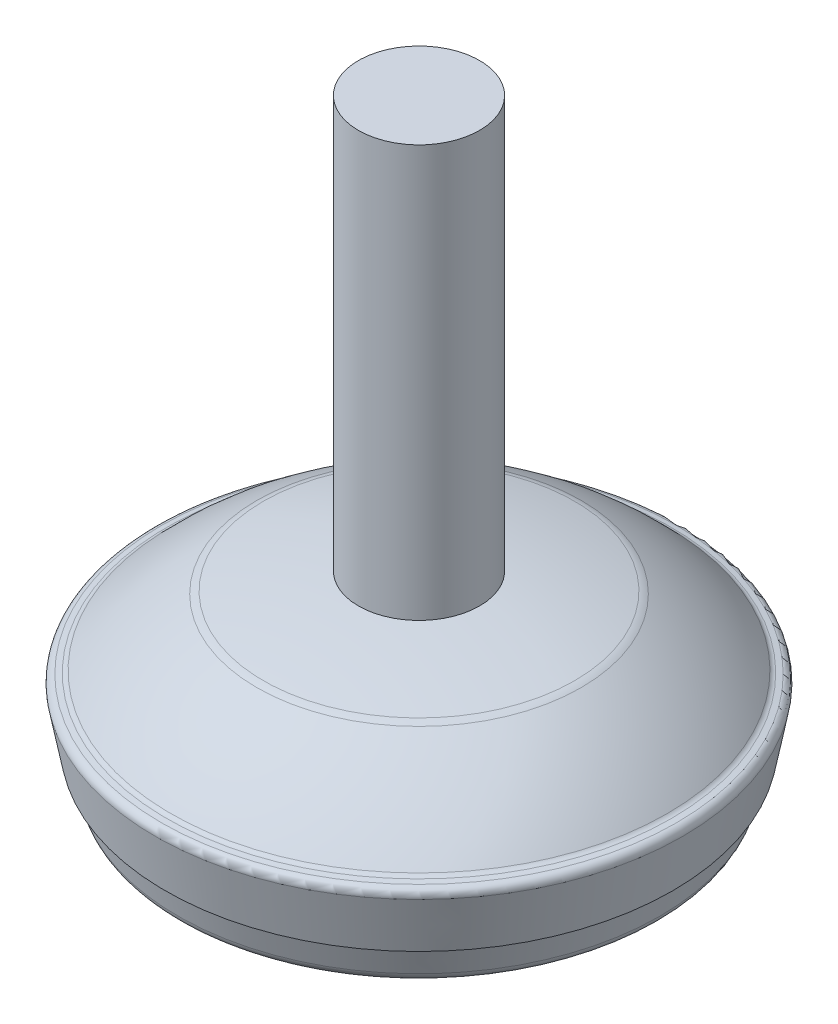
ISO-10303-21;
HEADER;
FILE_DESCRIPTION(('STEP AP214'),'2;1');
FILE_NAME('part.step','',(''),(''),'','','');
FILE_SCHEMA(('AUTOMOTIVE_DESIGN { 1 0 10303 214 1 1 1 1 }'));
ENDSEC;
DATA;
#1=APPLICATION_CONTEXT('core data for automotive mechanical design processes');
#2=APPLICATION_PROTOCOL_DEFINITION('international standard','automotive_design',2000,#1);
#3=PRODUCT_CONTEXT('',#1,'mechanical');
#4=PRODUCT('Part','Part','',(#3));
#5=PRODUCT_RELATED_PRODUCT_CATEGORY('part','',(#4));
#6=PRODUCT_DEFINITION_FORMATION('','',#4);
#7=PRODUCT_DEFINITION_CONTEXT('part definition',#1,'design');
#8=PRODUCT_DEFINITION('design','',#6,#7);
#9=PRODUCT_DEFINITION_SHAPE('','',#8);
#10=(LENGTH_UNIT() NAMED_UNIT(*) SI_UNIT(.MILLI.,.METRE.));
#11=(NAMED_UNIT(*) PLANE_ANGLE_UNIT() SI_UNIT($,.RADIAN.));
#12=(NAMED_UNIT(*) SI_UNIT($,.STERADIAN.) SOLID_ANGLE_UNIT());
#13=UNCERTAINTY_MEASURE_WITH_UNIT(LENGTH_MEASURE(1.E-05),#10,'distance_accuracy_value','');
#14=(GEOMETRIC_REPRESENTATION_CONTEXT(3) GLOBAL_UNCERTAINTY_ASSIGNED_CONTEXT((#13)) GLOBAL_UNIT_ASSIGNED_CONTEXT((#10,
#11,#12)) REPRESENTATION_CONTEXT('',''));
#15=CARTESIAN_POINT('',(0.,0.,0.));
#16=DIRECTION('',(0.,0.,1.));
#17=DIRECTION('',(1.,0.,0.));
#18=AXIS2_PLACEMENT_3D('',#15,#16,#17);
#19=CARTESIAN_POINT('',(-6.59704861767991E-13,27.0020000000001,0.));
#20=DIRECTION('',(0.,-1.,0.));
#21=DIRECTION('',(1.,0.,0.));
#22=AXIS2_PLACEMENT_3D('',#19,#20,#21);
#23=CYLINDRICAL_SURFACE('',#22,16.4);
#24=CARTESIAN_POINT('',(1.47550819892878E-13,-6.03931768529043,0.));
#25=DIRECTION('',(0.,-1.,0.));
#26=DIRECTION('',(1.,0.,0.));
#27=AXIS2_PLACEMENT_3D('',#24,#25,#26);
#28=CIRCLE('',#27,16.4);
#29=CARTESIAN_POINT('',(16.3999999999996,-6.03931768529003,0.));
#30=VERTEX_POINT('',#29);
#31=EDGE_CURVE('E87',#30,#30,#28,.F.);
#32=ORIENTED_EDGE('',*,*,#31,.F.);
#33=EDGE_LOOP('',(#32));
#34=FACE_BOUND('',#33,.T.);
#35=CARTESIAN_POINT('',(0.,-10.119943840269,0.));
#36=DIRECTION('',(0.,-1.,0.));
#37=DIRECTION('',(0.,0.,-1.));
#38=AXIS2_PLACEMENT_3D('',#35,#36,#37);
#39=CIRCLE('',#38,16.3999999999997);
#40=CARTESIAN_POINT('',(0.,-10.119943840269,-16.3999999999997));
#41=VERTEX_POINT('',#40);
#42=EDGE_CURVE('E96',#41,#41,#39,.T.);
#43=ORIENTED_EDGE('',*,*,#42,.F.);
#44=EDGE_LOOP('',(#43));
#45=FACE_BOUND('',#44,.T.);
#46=ADVANCED_FACE('F49',(#34,#45),#23,.T.);
#47=CARTESIAN_POINT('',(0.,-21.3204752240585,0.));
#48=DIRECTION('',(0.,-1.,0.));
#49=DIRECTION('',(1.,0.,0.));
#50=AXIS2_PLACEMENT_3D('',#47,#48,#49);
#51=SPHERICAL_SURFACE('',#50,22.4159268317116);
#52=CARTESIAN_POINT('',(0.,-1.60968282212924,0.));
#53=DIRECTION('',(0.,-1.,0.));
#54=DIRECTION('',(0.,0.,-1.));
#55=AXIS2_PLACEMENT_3D('',#52,#53,#54);
#56=CIRCLE('',#55,10.6751317843245);
#57=CARTESIAN_POINT('',(10.6751317843245,-1.60968282212924,0.));
#58=VERTEX_POINT('',#57);
#59=EDGE_CURVE('E93',#58,#58,#56,.F.);
#60=CARTESIAN_POINT('',(16.3999999999996,-6.03931768529003,0.));
#61=CARTESIAN_POINT('',(16.3483724371763,-5.98391007984378,0.));
#62=CARTESIAN_POINT('',(16.2964640613425,-5.92876413009407,0.));
#63=CARTESIAN_POINT('',(16.1920910611752,-5.81900116417844,0.));
#64=CARTESIAN_POINT('',(16.1396264368417,-5.76438414801254,0.));
#65=CARTESIAN_POINT('',(16.0341463171961,-5.65568467145529,0.));
#66=CARTESIAN_POINT('',(15.981130821884,-5.60160221106394,0.));
#67=CARTESIAN_POINT('',(15.8745544097037,-5.4939773987732,0.));
#68=CARTESIAN_POINT('',(15.8209934928354,-5.44043504687381,0.));
#69=CARTESIAN_POINT('',(15.7133317388926,-5.33389595270117,0.));
#70=CARTESIAN_POINT('',(15.6592309018181,-5.28089921042792,0.));
#71=CARTESIAN_POINT('',(15.550494865377,-5.17545677954696,0.));
#72=CARTESIAN_POINT('',(15.4958596660105,-5.12301109093925,0.));
#73=CARTESIAN_POINT('',(15.3860605174993,-5.01867615510006,0.));
#74=CARTESIAN_POINT('',(15.3308965683546,-4.96678690786859,0.));
#75=CARTESIAN_POINT('',(15.2200455871973,-4.86357018525535,0.));
#76=CARTESIAN_POINT('',(15.1643585551846,-4.81224270987357,0.));
#77=CARTESIAN_POINT('',(15.0524671289158,-4.71015480374344,0.));
#78=CARTESIAN_POINT('',(14.9962627346597,-4.65939437299509,0.));
#79=CARTESIAN_POINT('',(14.8833423576817,-4.55844577065869,0.));
#80=CARTESIAN_POINT('',(14.8266263749599,-4.50825759907065,0.));
#81=CARTESIAN_POINT('',(14.7126886473815,-4.40845867079601,0.));
#82=CARTESIAN_POINT('',(14.6554669025248,-4.35884791410942,0.));
#83=CARTESIAN_POINT('',(14.540523528964,-4.26020891206167,0.));
#84=CARTESIAN_POINT('',(14.4828019002599,-4.21118066670051,0.));
#85=CARTESIAN_POINT('',(14.3668646886434,-4.11371172388736,0.));
#86=CARTESIAN_POINT('',(14.3086491057311,-4.06527102643537,0.));
#87=CARTESIAN_POINT('',(14.1917299660808,-3.96898215566651,0.));
#88=CARTESIAN_POINT('',(14.1330264093428,-3.92113398234965,0.));
#89=CARTESIAN_POINT('',(14.0151373525521,-3.82603507520808,0.));
#90=CARTESIAN_POINT('',(13.9559518524995,-3.77878434138338,0.));
#91=CARTESIAN_POINT('',(13.8371049890998,-3.68488516720927,0.));
#92=CARTESIAN_POINT('',(13.7774436257528,-3.63823672685987,0.));
#93=CARTESIAN_POINT('',(13.6576511646693,-3.54554693174696,0.));
#94=CARTESIAN_POINT('',(13.5975200669328,-3.49950557698347,0.));
#95=CARTESIAN_POINT('',(13.4767943142302,-3.40803468278818,0.));
#96=CARTESIAN_POINT('',(13.416199659264,-3.36260514335639,0.));
#97=CARTESIAN_POINT('',(13.2945530168822,-3.27236254671964,0.));
#98=CARTESIAN_POINT('',(13.2335010294665,-3.22754948951466,0.));
#99=CARTESIAN_POINT('',(13.110945993947,-3.13854446089652,0.));
#100=CARTESIAN_POINT('',(13.0494429458431,-3.09435248948336,0.));
#101=CARTESIAN_POINT('',(12.9259921070448,-3.0065941722108,0.));
#102=CARTESIAN_POINT('',(12.8640443163504,-2.96302782635141,0.));
#103=CARTESIAN_POINT('',(12.7397103561567,-2.87652523567895,0.));
#104=CARTESIAN_POINT('',(12.6773241866573,-2.83358899086588,0.));
#105=CARTESIAN_POINT('',(12.5521198776727,-2.74835101304959,0.));
#106=CARTESIAN_POINT('',(12.4893017381875,-2.70604928004637,0.));
#107=CARTESIAN_POINT('',(12.3632399424265,-2.62208467143055,0.));
#108=CARTESIAN_POINT('',(12.2999962861505,-2.58042179581794,0.));
#109=CARTESIAN_POINT('',(12.1730899537145,-2.4977391819373,0.));
#110=CARTESIAN_POINT('',(12.1094272775544,-2.45671944366925,0.));
#111=CARTESIAN_POINT('',(11.9816894453056,-2.37532731835647,0.));
#112=CARTESIAN_POINT('',(11.9176142892169,-2.33495493131172,0.));
#113=CARTESIAN_POINT('',(11.7890580794254,-2.25486165584858,0.));
#114=CARTESIAN_POINT('',(11.7245770257227,-2.21514076743018,0.));
#115=CARTESIAN_POINT('',(11.5952156447681,-2.13635456960024,0.));
#116=CARTESIAN_POINT('',(11.5303353175161,-2.09728926018869,0.));
#117=CARTESIAN_POINT('',(11.4001820543471,-2.01981823376195,0.));
#118=CARTESIAN_POINT('',(11.33490911843,-1.98141251674676,0.));
#119=CARTESIAN_POINT('',(11.2039773438827,-1.90526461941697,0.));
#120=CARTESIAN_POINT('',(11.1383185052524,-1.86752243910237,0.));
#121=CARTESIAN_POINT('',(11.0066216681276,-1.79270549626466,0.));
#122=CARTESIAN_POINT('',(10.940583669633,-1.75563073374154,0.));
#123=CARTESIAN_POINT('',(10.8081353048282,-1.68215242053927,0.));
#124=CARTESIAN_POINT('',(10.741724938518,-1.64574886986013,0.));
#125=CARTESIAN_POINT('',(10.6751317843245,-1.60968282212924,0.));
#126=B_SPLINE_CURVE_WITH_KNOTS('',3,(#60,#61,#62,#63,#64,#65,#66,#67,#68,#69,#70,#71,#72,#73,
#74,#75,#76,#77,#78,#79,#80,#81,#82,#83,#84,#85,#86,#87,#88,#89,#90,#91,#92,#93,#94,#95,#96,#97,
#98,#99,#100,#101,#102,#103,#104,#105,#106,#107,#108,#109,#110,#111,#112,#113,#114,#115,#116,
#117,#118,#119,#120,#121,#122,#123,#124,#125),.UNSPECIFIED.,.F.,.F.,(4,2,2,2,2,2,2,2,2,2,2,2,2,
2,2,2,2,2,2,2,2,2,2,2,2,2,2,2,2,2,2,2,4),(0.,0.227196456346278,0.454392912692557,
0.681589369038833,0.908785825385109,1.13598228173139,1.36317873807767,1.59037519442394,
1.81757165077022,2.0447681071165,2.27196456346277,2.49916101980905,2.72635747615533,
2.9535539325016,3.18075038884788,3.40794684519416,3.63514330154044,3.86233975788671,
4.08953621423299,4.31673267057927,4.54392912692555,4.77112558327182,4.9983220396181,
5.22551849596438,5.45271495231065,5.67991140865693,5.90710786500321,6.13430432134948,
6.36150077769576,6.58869723404204,6.81589369038832,7.0430901467346,7.27028660308087),.UNSPECIFIED.);
#127=EDGE_CURVE('BSEAM129',#30,#58,#126,.T.);
#128=ORIENTED_EDGE('',*,*,#31,.T.);
#129=ORIENTED_EDGE('',*,*,#59,.F.);
#130=ORIENTED_EDGE('',*,*,#127,.T.);
#131=ORIENTED_EDGE('',*,*,#127,.F.);
#132=EDGE_LOOP('',(#128,#130,#129,#131));
#133=FACE_BOUND('',#132,.T.);
#134=ADVANCED_FACE('F129',(#133),#51,.T.);
#135=CARTESIAN_POINT('',(0.,-3.36832457269425,0.));
#136=DIRECTION('',(0.,1.,0.));
#137=DIRECTION('',(0.,0.,1.));
#138=AXIS2_PLACEMENT_3D('',#135,#136,#137);
#139=TOROIDAL_SURFACE('',#138,9.72267223496318,2.);
#140=ORIENTED_EDGE('',*,*,#59,.T.);
#141=EDGE_LOOP('',(#140));
#142=FACE_BOUND('',#141,.T.);
#143=CARTESIAN_POINT('',(0.,-1.43525462930082,0.));
#144=DIRECTION('',(0.,-1.,0.));
#145=DIRECTION('',(0.,0.,-1.));
#146=AXIS2_PLACEMENT_3D('',#143,#144,#145);
#147=CIRCLE('',#146,10.2357420098953);
#148=CARTESIAN_POINT('',(0.,-1.43525462930082,-10.2357420098953));
#149=VERTEX_POINT('',#148);
#150=EDGE_CURVE('E90',#149,#149,#147,.T.);
#151=ORIENTED_EDGE('',*,*,#150,.T.);
#152=EDGE_LOOP('',(#151));
#153=FACE_BOUND('',#152,.T.);
#154=ADVANCED_FACE('F135',(#142,#153),#139,.T.);
#155=CARTESIAN_POINT('',(0.,-40.,0.));
#156=DIRECTION('',(0.,-1.,0.));
#157=DIRECTION('',(1.,0.,0.));
#158=AXIS2_PLACEMENT_3D('',#155,#156,#157);
#159=SPHERICAL_SURFACE('',#158,39.9);
#160=ORIENTED_EDGE('',*,*,#150,.F.);
#161=EDGE_LOOP('',(#160));
#162=FACE_BOUND('',#161,.T.);
#163=ADVANCED_FACE('F142',(#162),#159,.T.);
#164=CARTESIAN_POINT('',(0.,-12.619943840269,0.));
#165=DIRECTION('',(0.,1.,0.));
#166=DIRECTION('',(0.,0.,1.));
#167=AXIS2_PLACEMENT_3D('',#164,#165,#166);
#168=CONICAL_SURFACE('',#167,15.75,0.254368058553167);
#169=CARTESIAN_POINT('',(0.,-11.9838326142687,0.));
#170=DIRECTION('',(0.,-1.,0.));
#171=DIRECTION('',(1.,0.,0.));
#172=AXIS2_PLACEMENT_3D('',#169,#170,#171);
#173=CIRCLE('',#172,15.91538891876);
#174=CARTESIAN_POINT('',(15.91538891876,-11.9838326142683,0.));
#175=VERTEX_POINT('',#174);
#176=EDGE_CURVE('E69',#175,#175,#173,.F.);
#177=ORIENTED_EDGE('',*,*,#176,.T.);
#178=EDGE_LOOP('',(#177));
#179=FACE_BOUND('',#178,.T.);
#180=ORIENTED_EDGE('',*,*,#42,.T.);
#181=EDGE_LOOP('',(#180));
#182=FACE_BOUND('',#181,.T.);
#183=ADVANCED_FACE('F182',(#179,#182),#168,.T.);
#184=CARTESIAN_POINT('',(3.08326727896606E-13,-12.6199438402686,0.));
#185=DIRECTION('',(0.,-1.,0.));
#186=DIRECTION('',(1.,0.,0.));
#187=AXIS2_PLACEMENT_3D('',#184,#185,#186);
#188=PLANE('',#187);
#189=CARTESIAN_POINT('',(0.,-12.6199438402686,0.));
#190=DIRECTION('',(0.,-1.,0.));
#191=DIRECTION('',(1.,0.,0.));
#192=AXIS2_PLACEMENT_3D('',#189,#190,#191);
#193=CIRCLE('',#192,13.85);
#194=CARTESIAN_POINT('',(13.85,-12.6199438402682,0.));
#195=VERTEX_POINT('',#194);
#196=EDGE_CURVE('E72',#195,#195,#193,.F.);
#197=ORIENTED_EDGE('',*,*,#196,.T.);
#198=EDGE_LOOP('',(#197));
#199=FACE_BOUND('',#198,.T.);
#200=CARTESIAN_POINT('',(1.16639697968341E-13,-12.6199438402686,0.));
#201=DIRECTION('',(0.,-1.,0.));
#202=DIRECTION('',(1.,0.,0.));
#203=AXIS2_PLACEMENT_3D('',#200,#201,#202);
#204=CIRCLE('',#203,15.09273978799);
#205=CARTESIAN_POINT('',(15.0927397879901,-12.6199438402682,0.));
#206=VERTEX_POINT('',#205);
#207=EDGE_CURVE('E75',#206,#206,#204,.T.);
#208=ORIENTED_EDGE('',*,*,#207,.T.);
#209=EDGE_LOOP('',(#208));
#210=FACE_BOUND('',#209,.T.);
#211=ADVANCED_FACE('F169',(#199,#210),#188,.T.);
#212=CARTESIAN_POINT('',(0.,-12.619943840269,0.));
#213=DIRECTION('',(0.,-1.,0.));
#214=DIRECTION('',(0.,0.,-1.));
#215=AXIS2_PLACEMENT_3D('',#212,#213,#214);
#216=CYLINDRICAL_SURFACE('',#215,13.);
#217=CARTESIAN_POINT('',(0.,-11.7699438402686,0.));
#218=DIRECTION('',(0.,-1.,0.));
#219=DIRECTION('',(1.,0.,0.));
#220=AXIS2_PLACEMENT_3D('',#217,#218,#219);
#221=CIRCLE('',#220,13.);
#222=CARTESIAN_POINT('',(13.,-11.7699438402682,0.));
#223=VERTEX_POINT('',#222);
#224=EDGE_CURVE('E78',#223,#223,#221,.T.);
#225=ORIENTED_EDGE('',*,*,#224,.T.);
#226=EDGE_LOOP('',(#225));
#227=FACE_BOUND('',#226,.T.);
#228=CARTESIAN_POINT('',(0.,-11.619943840269,0.));
#229=DIRECTION('',(0.,-1.,0.));
#230=DIRECTION('',(0.,0.,-1.));
#231=AXIS2_PLACEMENT_3D('',#228,#229,#230);
#232=CIRCLE('',#231,13.);
#233=CARTESIAN_POINT('',(0.,-11.619943840269,-13.));
#234=VERTEX_POINT('',#233);
#235=EDGE_CURVE('E99',#234,#234,#232,.T.);
#236=ORIENTED_EDGE('',*,*,#235,.F.);
#237=EDGE_LOOP('',(#236));
#238=FACE_BOUND('',#237,.T.);
#239=ADVANCED_FACE('F181',(#227,#238),#216,.F.);
#240=CARTESIAN_POINT('',(-13.,-11.619943840269,0.));
#241=DIRECTION('',(0.,-1.,0.));
#242=DIRECTION('',(0.,0.,-1.));
#243=AXIS2_PLACEMENT_3D('',#240,#241,#242);
#244=PLANE('',#243);
#245=ORIENTED_EDGE('',*,*,#235,.T.);
#246=EDGE_LOOP('',(#245));
#247=FACE_BOUND('',#246,.T.);
#248=CARTESIAN_POINT('',(0.,-11.619943840269,0.));
#249=DIRECTION('',(0.,-1.,0.));
#250=DIRECTION('',(0.,0.,-1.));
#251=AXIS2_PLACEMENT_3D('',#248,#249,#250);
#252=CIRCLE('',#251,11.25);
#253=CARTESIAN_POINT('',(0.,-11.619943840269,-11.25));
#254=VERTEX_POINT('',#253);
#255=EDGE_CURVE('E102',#254,#254,#252,.T.);
#256=ORIENTED_EDGE('',*,*,#255,.F.);
#257=EDGE_LOOP('',(#256));
#258=FACE_BOUND('',#257,.T.);
#259=ADVANCED_FACE('F175',(#247,#258),#244,.T.);
#260=CARTESIAN_POINT('',(0.,-12.619943840269,0.));
#261=DIRECTION('',(0.,-1.,0.));
#262=DIRECTION('',(0.,0.,-1.));
#263=AXIS2_PLACEMENT_3D('',#260,#261,#262);
#264=CYLINDRICAL_SURFACE('',#263,11.25);
#265=CARTESIAN_POINT('',(0.,-11.7699438402686,0.));
#266=DIRECTION('',(0.,-1.,0.));
#267=DIRECTION('',(1.,0.,0.));
#268=AXIS2_PLACEMENT_3D('',#265,#266,#267);
#269=CIRCLE('',#268,11.25);
#270=CARTESIAN_POINT('',(11.25,-11.7699438402683,0.));
#271=VERTEX_POINT('',#270);
#272=EDGE_CURVE('E56',#271,#271,#269,.F.);
#273=ORIENTED_EDGE('',*,*,#272,.T.);
#274=EDGE_LOOP('',(#273));
#275=FACE_BOUND('',#274,.T.);
#276=ORIENTED_EDGE('',*,*,#255,.T.);
#277=EDGE_LOOP('',(#276));
#278=FACE_BOUND('',#277,.T.);
#279=ADVANCED_FACE('F167',(#275,#278),#264,.T.);
#280=CARTESIAN_POINT('',(0.,-12.6199438402686,0.));
#281=DIRECTION('',(0.,-1.,0.));
#282=DIRECTION('',(1.,0.,0.));
#283=AXIS2_PLACEMENT_3D('',#280,#281,#282);
#284=CIRCLE('',#283,10.4);
#285=CARTESIAN_POINT('',(10.4,-12.6199438402683,0.));
#286=VERTEX_POINT('',#285);
#287=EDGE_CURVE('E60',#286,#286,#284,.T.);
#288=ORIENTED_EDGE('',*,*,#287,.T.);
#289=EDGE_LOOP('',(#288));
#290=FACE_BOUND('',#289,.T.);
#291=CARTESIAN_POINT('',(0.,-12.6199438402686,0.));
#292=DIRECTION('',(0.,-1.,0.));
#293=DIRECTION('',(1.,0.,0.));
#294=AXIS2_PLACEMENT_3D('',#291,#292,#293);
#295=CIRCLE('',#294,10.35);
#296=CARTESIAN_POINT('',(10.35,-12.6199438402683,0.));
#297=VERTEX_POINT('',#296);
#298=EDGE_CURVE('E64',#297,#297,#295,.F.);
#299=ORIENTED_EDGE('',*,*,#298,.T.);
#300=EDGE_LOOP('',(#299));
#301=FACE_BOUND('',#300,.T.);
#302=ADVANCED_FACE('F126',(#290,#301),#188,.T.);
#303=CARTESIAN_POINT('',(0.,-12.619943840269,0.));
#304=DIRECTION('',(0.,-1.,0.));
#305=DIRECTION('',(0.,0.,-1.));
#306=AXIS2_PLACEMENT_3D('',#303,#304,#305);
#307=CYLINDRICAL_SURFACE('',#306,9.5);
#308=CARTESIAN_POINT('',(0.,-11.7699438402686,0.));
#309=DIRECTION('',(0.,-1.,0.));
#310=DIRECTION('',(1.,0.,0.));
#311=AXIS2_PLACEMENT_3D('',#308,#309,#310);
#312=CIRCLE('',#311,9.5);
#313=CARTESIAN_POINT('',(9.5,-11.7699438402683,0.));
#314=VERTEX_POINT('',#313);
#315=EDGE_CURVE('E11',#314,#314,#312,.T.);
#316=ORIENTED_EDGE('',*,*,#315,.T.);
#317=EDGE_LOOP('',(#316));
#318=FACE_BOUND('',#317,.T.);
#319=CARTESIAN_POINT('',(0.,-11.619943840269,0.));
#320=DIRECTION('',(0.,-1.,0.));
#321=DIRECTION('',(0.,0.,-1.));
#322=AXIS2_PLACEMENT_3D('',#319,#320,#321);
#323=CIRCLE('',#322,9.5);
#324=CARTESIAN_POINT('',(0.,-11.619943840269,-9.5));
#325=VERTEX_POINT('',#324);
#326=EDGE_CURVE('E105',#325,#325,#323,.T.);
#327=ORIENTED_EDGE('',*,*,#326,.F.);
#328=EDGE_LOOP('',(#327));
#329=FACE_BOUND('',#328,.T.);
#330=ADVANCED_FACE('F116',(#318,#329),#307,.F.);
#331=CARTESIAN_POINT('',(-9.5,-11.619943840269,0.));
#332=DIRECTION('',(0.,-1.,0.));
#333=DIRECTION('',(0.,0.,-1.));
#334=AXIS2_PLACEMENT_3D('',#331,#332,#333);
#335=PLANE('',#334);
#336=ORIENTED_EDGE('',*,*,#326,.T.);
#337=EDGE_LOOP('',(#336));
#338=FACE_BOUND('',#337,.T.);
#339=CARTESIAN_POINT('',(0.,-11.619943840269,0.));
#340=DIRECTION('',(0.,-1.,0.));
#341=DIRECTION('',(0.,0.,-1.));
#342=AXIS2_PLACEMENT_3D('',#339,#340,#341);
#343=CIRCLE('',#342,8.25);
#344=CARTESIAN_POINT('',(0.,-11.619943840269,-8.25));
#345=VERTEX_POINT('',#344);
#346=EDGE_CURVE('E108',#345,#345,#343,.T.);
#347=ORIENTED_EDGE('',*,*,#346,.F.);
#348=EDGE_LOOP('',(#347));
#349=FACE_BOUND('',#348,.T.);
#350=ADVANCED_FACE('F114',(#338,#349),#335,.T.);
#351=CARTESIAN_POINT('',(0.,-12.619943840269,0.));
#352=DIRECTION('',(0.,-1.,0.));
#353=DIRECTION('',(0.,0.,-1.));
#354=AXIS2_PLACEMENT_3D('',#351,#352,#353);
#355=CYLINDRICAL_SURFACE('',#354,8.25);
#356=CARTESIAN_POINT('',(0.,-11.7699438402686,0.));
#357=DIRECTION('',(0.,-1.,0.));
#358=DIRECTION('',(1.,0.,0.));
#359=AXIS2_PLACEMENT_3D('',#356,#357,#358);
#360=CIRCLE('',#359,8.25);
#361=CARTESIAN_POINT('',(8.25,-11.7699438402684,0.));
#362=VERTEX_POINT('',#361);
#363=EDGE_CURVE('E81',#362,#362,#360,.F.);
#364=ORIENTED_EDGE('',*,*,#363,.T.);
#365=EDGE_LOOP('',(#364));
#366=FACE_BOUND('',#365,.T.);
#367=ORIENTED_EDGE('',*,*,#346,.T.);
#368=EDGE_LOOP('',(#367));
#369=FACE_BOUND('',#368,.T.);
#370=ADVANCED_FACE('F112',(#366,#369),#355,.T.);
#371=CARTESIAN_POINT('',(0.,-12.6199438402686,0.));
#372=DIRECTION('',(0.,-1.,0.));
#373=DIRECTION('',(1.,0.,0.));
#374=AXIS2_PLACEMENT_3D('',#371,#372,#373);
#375=CIRCLE('',#374,7.4);
#376=CARTESIAN_POINT('',(7.40000000000002,-12.6199438402684,0.));
#377=VERTEX_POINT('',#376);
#378=EDGE_CURVE('E84',#377,#377,#375,.T.);
#379=ORIENTED_EDGE('',*,*,#378,.T.);
#380=EDGE_LOOP('',(#379));
#381=FACE_BOUND('',#380,.T.);
#382=ADVANCED_FACE('F123',(#381),#188,.T.);
#383=CARTESIAN_POINT('',(0.,-11.7699438402686,0.));
#384=DIRECTION('',(0.,-1.,0.));
#385=DIRECTION('',(1.,0.,0.));
#386=AXIS2_PLACEMENT_3D('',#383,#384,#385);
#387=TOROIDAL_SURFACE('',#386,7.4,0.85);
#388=ORIENTED_EDGE('',*,*,#363,.F.);
#389=EDGE_LOOP('',(#388));
#390=FACE_BOUND('',#389,.T.);
#391=ORIENTED_EDGE('',*,*,#378,.F.);
#392=EDGE_LOOP('',(#391));
#393=FACE_BOUND('',#392,.T.);
#394=ADVANCED_FACE('F144',(#390,#393),#387,.T.);
#395=CARTESIAN_POINT('',(0.,-11.7699438402686,0.));
#396=DIRECTION('',(0.,-1.,0.));
#397=DIRECTION('',(1.,0.,0.));
#398=AXIS2_PLACEMENT_3D('',#395,#396,#397);
#399=TOROIDAL_SURFACE('',#398,13.85,0.85);
#400=ORIENTED_EDGE('',*,*,#196,.F.);
#401=EDGE_LOOP('',(#400));
#402=FACE_BOUND('',#401,.T.);
#403=ORIENTED_EDGE('',*,*,#224,.F.);
#404=EDGE_LOOP('',(#403));
#405=FACE_BOUND('',#404,.T.);
#406=ADVANCED_FACE('F147',(#402,#405),#399,.T.);
#407=CARTESIAN_POINT('',(0.,-11.7699438402686,0.));
#408=DIRECTION('',(0.,-1.,0.));
#409=DIRECTION('',(1.,0.,0.));
#410=AXIS2_PLACEMENT_3D('',#407,#408,#409);
#411=TOROIDAL_SURFACE('',#410,15.09273978799,0.85);
#412=ORIENTED_EDGE('',*,*,#176,.F.);
#413=EDGE_LOOP('',(#412));
#414=FACE_BOUND('',#413,.T.);
#415=ORIENTED_EDGE('',*,*,#207,.F.);
#416=EDGE_LOOP('',(#415));
#417=FACE_BOUND('',#416,.T.);
#418=ADVANCED_FACE('F151',(#414,#417),#411,.T.);
#419=CARTESIAN_POINT('',(0.,-11.7699438402686,0.));
#420=DIRECTION('',(0.,-1.,0.));
#421=DIRECTION('',(1.,0.,0.));
#422=AXIS2_PLACEMENT_3D('',#419,#420,#421);
#423=TOROIDAL_SURFACE('',#422,10.4,0.85);
#424=ORIENTED_EDGE('',*,*,#272,.F.);
#425=EDGE_LOOP('',(#424));
#426=FACE_BOUND('',#425,.T.);
#427=ORIENTED_EDGE('',*,*,#287,.F.);
#428=EDGE_LOOP('',(#427));
#429=FACE_BOUND('',#428,.T.);
#430=ADVANCED_FACE('F154',(#426,#429),#423,.T.);
#431=CARTESIAN_POINT('',(0.,-11.7699438402686,0.));
#432=DIRECTION('',(0.,-1.,0.));
#433=DIRECTION('',(1.,0.,0.));
#434=AXIS2_PLACEMENT_3D('',#431,#432,#433);
#435=TOROIDAL_SURFACE('',#434,10.35,0.85);
#436=ORIENTED_EDGE('',*,*,#298,.F.);
#437=EDGE_LOOP('',(#436));
#438=FACE_BOUND('',#437,.T.);
#439=ORIENTED_EDGE('',*,*,#315,.F.);
#440=EDGE_LOOP('',(#439));
#441=FACE_BOUND('',#440,.T.);
#442=ADVANCED_FACE('F51',(#438,#441),#435,.T.);
#443=CLOSED_SHELL('',(#46,#134,#154,#163,#183,#211,#239,#259,#279,#302,#330,#350,#370,#382,#394,
#406,#418,#430,#442));
#444=MANIFOLD_SOLID_BREP('B2',#443);
#445=CARTESIAN_POINT('',(0.,-40.,0.));
#446=DIRECTION('',(0.,-1.,0.));
#447=DIRECTION('',(1.,0.,0.));
#448=AXIS2_PLACEMENT_3D('',#445,#446,#447);
#449=SPHERICAL_SURFACE('',#448,40.);
#450=CARTESIAN_POINT('',(0.,-0.200502515735203,0.));
#451=DIRECTION('',(0.,-1.,0.));
#452=DIRECTION('',(0.,0.,-1.));
#453=AXIS2_PLACEMENT_3D('',#450,#451,#452);
#454=CIRCLE('',#453,4.);
#455=CARTESIAN_POINT('',(3.99999999999996,-0.200502515735196,0.));
#456=VERTEX_POINT('',#455);
#457=EDGE_CURVE('E48',#456,#456,#454,.F.);
#458=CARTESIAN_POINT('',(0.,-1.34181512566388,0.));
#459=DIRECTION('',(0.,-1.,0.));
#460=DIRECTION('',(0.,0.,-1.));
#461=AXIS2_PLACEMENT_3D('',#458,#459,#460);
#462=CIRCLE('',#461,10.2734970784855);
#463=CARTESIAN_POINT('',(10.2734970784855,-1.34181512566387,0.));
#464=VERTEX_POINT('',#463);
#465=EDGE_CURVE('E375',#464,#464,#462,.F.);
#466=CARTESIAN_POINT('',(3.99999999999996,-0.200502515735196,0.));
#467=CARTESIAN_POINT('',(4.06615879051478,-0.207151722874971,0.));
#468=CARTESIAN_POINT('',(4.13230100123537,-0.213965896756605,0.));
#469=CARTESIAN_POINT('',(4.26455061886785,-0.227924002072879,0.));
#470=CARTESIAN_POINT('',(4.33065802577975,-0.23506793350752,0.));
#471=CARTESIAN_POINT('',(4.46283639157466,-0.249685377999097,0.));
#472=CARTESIAN_POINT('',(4.52890735045767,-0.257158891056034,0.));
#473=CARTESIAN_POINT('',(4.66101117711293,-0.272435312467659,0.));
#474=CARTESIAN_POINT('',(4.72704404488519,-0.280238220822347,0.));
#475=CARTESIAN_POINT('',(4.85907004712225,-0.296173238901938,0.));
#476=CARTESIAN_POINT('',(4.92506318158706,-0.30430534862684,0.));
#477=CARTESIAN_POINT('',(5.0570080760173,-0.320898567174572,0.));
#478=CARTESIAN_POINT('',(5.12295983598273,-0.329359675997402,0.));
#479=CARTESIAN_POINT('',(5.2548203412468,-0.346610682329062,0.));
#480=CARTESIAN_POINT('',(5.32072908654544,-0.355400579837891,0.));
#481=CARTESIAN_POINT('',(5.45250192337942,-0.373308944941559,0.));
#482=CARTESIAN_POINT('',(5.51836601491476,-0.382427412536397,0.));
#483=CARTESIAN_POINT('',(5.65004790623585,-0.400992691043879,0.));
#484=CARTESIAN_POINT('',(5.71586570602158,-0.410439501956522,0.));
#485=CARTESIAN_POINT('',(5.84745337700847,-0.42966123216496,0.));
#486=CARTESIAN_POINT('',(5.91322324820962,-0.439436151460756,0.));
#487=CARTESIAN_POINT('',(6.04471342638425,-0.459313855341265,0.));
#488=CARTESIAN_POINT('',(6.11043373335774,-0.469416639925979,0.));
#489=CARTESIAN_POINT('',(6.24182314866662,-0.489949823136307,0.));
#490=CARTESIAN_POINT('',(6.30749225700201,-0.50038022176192,0.));
#491=CARTESIAN_POINT('',(6.43877764189753,-0.521568373658538,0.));
#492=CARTESIAN_POINT('',(6.50439391845766,-0.532326126929544,0.));
#493=CARTESIAN_POINT('',(6.63557200797935,-0.5541687205804,0.));
#494=CARTESIAN_POINT('',(6.70113382094092,-0.565253560960249,0.));
#495=CARTESIAN_POINT('',(6.83220135279669,-0.58775005315784,0.));
#496=CARTESIAN_POINT('',(6.89770707169089,-0.599161704975582,0.));
#497=CARTESIAN_POINT('',(7.02866078633809,-0.622311536250499,0.));
#498=CARTESIAN_POINT('',(7.0941087820911,-0.634049715707675,0.));
#499=CARTESIAN_POINT('',(7.22494542281765,-0.657852310342499,0.));
#500=CARTESIAN_POINT('',(7.29033406779119,-0.669916725520147,0.));
#501=CARTESIAN_POINT('',(7.42105038079653,-0.694371491563751,0.));
#502=CARTESIAN_POINT('',(7.48637804882834,-0.706761842429707,0.));
#503=CARTESIAN_POINT('',(7.61697078330437,-0.731868171712005,0.));
#504=CARTESIAN_POINT('',(7.6822358497486,-0.744584150128347,0.));
#505=CARTESIAN_POINT('',(7.81270175796051,-0.770341418275409,0.));
#506=CARTESIAN_POINT('',(7.87790259972819,-0.783382708006128,0.));
#507=CARTESIAN_POINT('',(8.00823843709524,-0.809790274455695,0.));
#508=CARTESIAN_POINT('',(8.07337343269461,-0.823156551174543,0.));
#509=CARTESIAN_POINT('',(8.20357595787081,-0.850213759191974,0.));
#510=CARTESIAN_POINT('',(8.26864348744765,-0.863904690490558,0.));
#511=CARTESIAN_POINT('',(8.39870946240238,-0.891610867185167,0.));
#512=CARTESIAN_POINT('',(8.46370790778028,-0.905626112581193,0.));
#513=CARTESIAN_POINT('',(8.59363409787883,-0.933980568922917,0.));
#514=CARTESIAN_POINT('',(8.65856184259948,-0.948319779868616,0.));
#515=CARTESIAN_POINT('',(8.78834501668341,-0.977321810705382,0.));
#516=CARTESIAN_POINT('',(8.8532004460467,-0.991984630596449,0.));
#517=CARTESIAN_POINT('',(8.98283737651444,-1.02163351467094,0.));
#518=CARTESIAN_POINT('',(9.0476188776189,-1.03661957885437,0.));
#519=CARTESIAN_POINT('',(9.17710634050526,-1.06691457882472,0.));
#520=CARTESIAN_POINT('',(9.24181230228717,-1.08222351461164,0.));
#521=CARTESIAN_POINT('',(9.37114707734621,-1.11316387705955,0.));
#522=CARTESIAN_POINT('',(9.43577589062334,-1.12879530372053,0.));
#523=CARTESIAN_POINT('',(9.56495476139848,-1.16038025920816,0.));
#524=CARTESIAN_POINT('',(9.6295048188965,-1.17633378803482,0.));
#525=CARTESIAN_POINT('',(9.75852457283767,-1.20856255098145,0.));
#526=CARTESIAN_POINT('',(9.82299426928082,-1.22483778510143,0.));
#527=CARTESIAN_POINT('',(9.9518516976858,-1.25770955433481,0.));
#528=CARTESIAN_POINT('',(10.0162394296476,-1.2743060894482,0.));
#529=CARTESIAN_POINT('',(10.1449313282588,-1.30782004623969,0.));
#530=CARTESIAN_POINT('',(10.2092354949081,-1.32473746791778,0.));
#531=CARTESIAN_POINT('',(10.2734970784855,-1.34181512566387,0.));
#532=B_SPLINE_CURVE_WITH_KNOTS('',3,(#466,#467,#468,#469,#470,#471,#472,#473,#474,#475,#476,
#477,#478,#479,#480,#481,#482,#483,#484,#485,#486,#487,#488,#489,#490,#491,#492,#493,#494,#495,
#496,#497,#498,#499,#500,#501,#502,#503,#504,#505,#506,#507,#508,#509,#510,#511,#512,#513,#514,
#515,#516,#517,#518,#519,#520,#521,#522,#523,#524,#525,#526,#527,#528,#529,#530,#531),
.UNSPECIFIED.,.F.,.F.,(4,2,2,2,2,2,2,2,2,2,2,2,2,2,2,2,2,2,2,2,2,2,2,2,2,2,2,2,2,2,2,2,4),(0.,
0.19947605166885,0.398952103337709,0.598428155006559,0.797904206675417,0.997380258344267,
1.19685631001312,1.39633236168198,1.59580841335083,1.79528446501967,1.99476051668853,
2.19423656835738,2.39371262002623,2.59318867169509,2.79266472336394,2.9921407750328,
3.19161682670165,3.3910928783705,3.59056893003936,3.79004498170821,3.98952103337707,
4.18899708504591,4.38847313671477,4.58794918838362,4.78742524005247,4.98690129172132,
5.18637734339018,5.38585339505903,5.58532944672788,5.78480549839674,5.98428155006559,
6.18375760173445,6.3832336534033),.UNSPECIFIED.);
#533=EDGE_CURVE('BSEAM368',#456,#464,#532,.T.);
#534=ORIENTED_EDGE('',*,*,#457,.F.);
#535=ORIENTED_EDGE('',*,*,#465,.T.);
#536=ORIENTED_EDGE('',*,*,#533,.T.);
#537=ORIENTED_EDGE('',*,*,#533,.F.);
#538=EDGE_LOOP('',(#534,#536,#535,#537));
#539=FACE_BOUND('',#538,.T.);
#540=ADVANCED_FACE('F368',(#539),#449,.T.);
#541=CARTESIAN_POINT('',(0.,-21.3204752240585,0.));
#542=DIRECTION('',(0.,-1.,0.));
#543=DIRECTION('',(1.,0.,0.));
#544=AXIS2_PLACEMENT_3D('',#541,#542,#543);
#545=SPHERICAL_SURFACE('',#544,22.5159268317116);
#546=CARTESIAN_POINT('',(0.,-1.51553006120209,0.));
#547=DIRECTION('',(0.,-1.,0.));
#548=DIRECTION('',(0.,0.,-1.));
#549=AXIS2_PLACEMENT_3D('',#546,#547,#548);
#550=CIRCLE('',#549,10.7112608122126);
#551=CARTESIAN_POINT('',(10.7112608122126,-1.51553006120208,0.));
#552=VERTEX_POINT('',#551);
#553=EDGE_CURVE('E379',#552,#552,#550,.T.);
#554=CARTESIAN_POINT('',(-3.77181971795322E-13,-5.88225702581348,0.));
#555=DIRECTION('',(0.,-1.,0.));
#556=DIRECTION('',(1.,0.,0.));
#557=AXIS2_PLACEMENT_3D('',#554,#555,#556);
#558=CIRCLE('',#557,16.3898865143834);
#559=CARTESIAN_POINT('',(16.389886514383,-5.88225702581308,0.));
#560=VERTEX_POINT('',#559);
#561=EDGE_CURVE('E391',#560,#560,#558,.F.);
#562=CARTESIAN_POINT('',(10.7112608122126,-1.51553006120208,0.));
#563=CARTESIAN_POINT('',(10.7771757823808,-1.55117934624372,0.));
#564=CARTESIAN_POINT('',(10.8429127674551,-1.58715772231141,0.));
#565=CARTESIAN_POINT('',(10.9740242424751,-1.65976901828491,0.));
#566=CARTESIAN_POINT('',(11.0393987324208,-1.69640193819072,0.));
#567=CARTESIAN_POINT('',(11.1697786922432,-1.77031868362651,0.));
#568=CARTESIAN_POINT('',(11.2347841621199,-1.80760250915648,0.));
#569=CARTESIAN_POINT('',(11.3644196033351,-1.88281734525222,0.));
#570=CARTESIAN_POINT('',(11.4290495746735,-1.92074835581798,0.));
#571=CARTESIAN_POINT('',(11.5579275751827,-1.9972537815628,0.));
#572=CARTESIAN_POINT('',(11.6221756043534,-2.03582819674185,0.));
#573=CARTESIAN_POINT('',(11.7502833156691,-2.11361658589324,0.));
#574=CARTESIAN_POINT('',(11.8141429978141,-2.15283055986556,0.));
#575=CARTESIAN_POINT('',(11.9414676487494,-2.23189415736103,0.));
#576=CARTESIAN_POINT('',(12.0049326175397,-2.27174378088417,0.));
#577=CARTESIAN_POINT('',(12.131461514836,-2.3520747047796,0.));
#578=CARTESIAN_POINT('',(12.194525443342,-2.3925560051519,0.));
#579=CARTESIAN_POINT('',(12.3202459731075,-2.47414624709509,0.));
#580=CARTESIAN_POINT('',(12.3829025743669,-2.51525518866598,0.));
#581=CARTESIAN_POINT('',(12.5078022032875,-2.59809661477866,0.));
#582=CARTESIAN_POINT('',(12.5700452309486,-2.63982909932044,0.));
#583=CARTESIAN_POINT('',(12.69411150755,-2.72391345098673,0.));
#584=CARTESIAN_POINT('',(12.7559347564902,-2.76626531811124,0.));
#585=CARTESIAN_POINT('',(12.8791553123759,-2.85158421280699,0.));
#586=CARTESIAN_POINT('',(12.9405526193213,-2.89455124037824,0.));
#587=CARTESIAN_POINT('',(13.0629151704063,-2.98109617250509,0.));
#588=CARTESIAN_POINT('',(13.1238804145459,-3.0246740770607,0.));
#589=CARTESIAN_POINT('',(13.2453727622814,-3.11243641879444,0.));
#590=CARTESIAN_POINT('',(13.3058998658773,-3.15662085597257,0.));
#591=CARTESIAN_POINT('',(13.4265098984666,-3.24559185812316,0.));
#592=CARTESIAN_POINT('',(13.48659282746,-3.29037842309561,0.));
#593=CARTESIAN_POINT('',(13.606308521066,-3.3805492159794,0.));
#594=CARTESIAN_POINT('',(13.6659412856787,-3.42593344389074,0.));
#595=CARTESIAN_POINT('',(13.7847507056228,-3.51729503821474,0.));
#596=CARTESIAN_POINT('',(13.8439273609542,-3.56327240462741,0.));
#597=CARTESIAN_POINT('',(13.9618186629056,-3.65581569238545,0.));
#598=CARTESIAN_POINT('',(14.0205333095256,-3.70238161373082,0.));
#599=CARTESIAN_POINT('',(14.1374947406826,-3.79609736911149,0.));
#600=CARTESIAN_POINT('',(14.1957415252197,-3.8432472031468,0.));
#601=CARTESIAN_POINT('',(14.311761425481,-3.93812608345326,0.));
#602=CARTESIAN_POINT('',(14.3695345412054,-3.98585512972442,0.));
#603=CARTESIAN_POINT('',(14.4846013443329,-4.08188767630575,0.));
#604=CARTESIAN_POINT('',(14.541895031736,-4.13019117661592,0.));
#605=CARTESIAN_POINT('',(14.6559972665073,-4.22736781581005,0.));
#606=CARTESIAN_POINT('',(14.7128058138755,-4.27624095469401,0.));
#607=CARTESIAN_POINT('',(14.8259321052279,-4.37455199878223,0.));
#608=CARTESIAN_POINT('',(14.8822498492121,-4.42398990398651,0.));
#609=CARTESIAN_POINT('',(14.9943889193768,-4.52342555215895,0.));
#610=CARTESIAN_POINT('',(15.0502102455573,-4.57342329512711,0.));
#611=CARTESIAN_POINT('',(15.1613509151823,-4.67397363446102,0.));
#612=CARTESIAN_POINT('',(15.2166702586268,-4.72452623082676,0.));
#613=CARTESIAN_POINT('',(15.3268014478964,-4.82618123727002,0.));
#614=CARTESIAN_POINT('',(15.3816132937215,-4.87728364734753,0.));
#615=CARTESIAN_POINT('',(15.4907240234425,-4.98003318673572,0.));
#616=CARTESIAN_POINT('',(15.5450229073383,-5.03168031604639,0.));
#617=CARTESIAN_POINT('',(15.6531023001032,-5.13551414504681,0.));
#618=CARTESIAN_POINT('',(15.7068828089722,-5.18770084473657,0.));
#619=CARTESIAN_POINT('',(15.8139200899866,-5.29260861211673,0.));
#620=CARTESIAN_POINT('',(15.8671768621319,-5.34532967980714,0.));
#621=CARTESIAN_POINT('',(15.9731613612486,-5.45130092654378,0.));
#622=CARTESIAN_POINT('',(16.0258890882202,-5.50455110559001,0.));
#623=CARTESIAN_POINT('',(16.1308102374194,-5.61157526935608,0.));
#624=CARTESIAN_POINT('',(16.1830036596471,-5.66534925407592,0.));
#625=CARTESIAN_POINT('',(16.2868510074659,-5.77341565743925,0.));
#626=CARTESIAN_POINT('',(16.3385049330569,-5.82770807608274,0.));
#627=CARTESIAN_POINT('',(16.389886514383,-5.88225702581308,0.));
#628=B_SPLINE_CURVE_WITH_KNOTS('',3,(#562,#563,#564,#565,#566,#567,#568,#569,#570,#571,#572,
#573,#574,#575,#576,#577,#578,#579,#580,#581,#582,#583,#584,#585,#586,#587,#588,#589,#590,#591,
#592,#593,#594,#595,#596,#597,#598,#599,#600,#601,#602,#603,#604,#605,#606,#607,#608,#609,#610,
#611,#612,#613,#614,#615,#616,#617,#618,#619,#620,#621,#622,#623,#624,#625,#626,#627),
.UNSPECIFIED.,.F.,.F.,(4,2,2,2,2,2,2,2,2,2,2,2,2,2,2,2,2,2,2,2,2,2,2,2,2,2,2,2,2,2,2,2,4),(0.,
0.224812084402049,0.449624168804099,0.674436253206151,0.8992483376082,1.12406042201025,
1.3488725064123,1.57368459081435,1.79849667521639,2.02330875961844,2.2481208440205,
2.47293292842254,2.69774501282459,2.92255709722664,3.14736918162869,3.37218126603074,
3.59699335043279,3.82180543483484,4.04661751923689,4.27142960363893,4.49624168804099,
4.72105377244303,4.94586585684508,5.17067794124713,5.39549002564918,5.62030211005123,
5.84511419445328,6.06992627885533,6.29473836325738,6.51955044765942,6.74436253206148,
6.96917461646352,7.19398670086557),.UNSPECIFIED.);
#629=EDGE_CURVE('BSEAM436',#552,#560,#628,.T.);
#630=ORIENTED_EDGE('',*,*,#553,.T.);
#631=ORIENTED_EDGE('',*,*,#561,.T.);
#632=ORIENTED_EDGE('',*,*,#629,.T.);
#633=ORIENTED_EDGE('',*,*,#629,.F.);
#634=EDGE_LOOP('',(#630,#632,#631,#633));
#635=FACE_BOUND('',#634,.T.);
#636=ADVANCED_FACE('F436',(#635),#545,.T.);
#637=CARTESIAN_POINT('',(1.51253878086416E-13,-6.19088542889316,0.));
#638=DIRECTION('',(0.,-1.,0.));
#639=DIRECTION('',(1.,0.,0.));
#640=AXIS2_PLACEMENT_3D('',#637,#638,#639);
#641=CONICAL_SURFACE('',#640,17.4999999999999,1.38217994061947);
#642=CARTESIAN_POINT('',(1.48963405869886E-13,-6.09713542889315,0.));
#643=DIRECTION('',(0.,1.,0.));
#644=DIRECTION('',(-1.,0.,0.));
#645=AXIS2_PLACEMENT_3D('',#642,#643,#644);
#646=CIRCLE('',#645,17.0088676985779);
#647=CARTESIAN_POINT('',(-17.0088676985778,-6.09713542889356,0.));
#648=VERTEX_POINT('',#647);
#649=EDGE_CURVE('E400',#648,#648,#646,.T.);
#650=ORIENTED_EDGE('',*,*,#649,.T.);
#651=EDGE_LOOP('',(#650));
#652=FACE_BOUND('',#651,.T.);
#653=CARTESIAN_POINT('',(-3.73558665600376E-13,-6.03056048626356,0.));
#654=DIRECTION('',(0.,-1.,0.));
#655=DIRECTION('',(1.,0.,0.));
#656=AXIS2_PLACEMENT_3D('',#653,#654,#655);
#657=CIRCLE('',#656,16.6600985808105);
#658=CARTESIAN_POINT('',(16.6600985808101,-6.03056048626315,0.));
#659=VERTEX_POINT('',#658);
#660=EDGE_CURVE('E403',#659,#659,#657,.T.);
#661=ORIENTED_EDGE('',*,*,#660,.T.);
#662=EDGE_LOOP('',(#661));
#663=FACE_BOUND('',#662,.T.);
#664=ADVANCED_FACE('F442',(#652,#663),#641,.T.);
#665=CARTESIAN_POINT('',(2.47247468789134E-13,-10.1199438402686,0.));
#666=DIRECTION('',(0.,1.,0.));
#667=DIRECTION('',(-1.,0.,0.));
#668=AXIS2_PLACEMENT_3D('',#665,#666,#667);
#669=CONICAL_SURFACE('',#668,16.7499999999998,0.188616386175428);
#670=CARTESIAN_POINT('',(1.63253076924256E-13,-6.68201773031508,0.));
#671=DIRECTION('',(0.,-1.,0.));
#672=DIRECTION('',(1.,0.,0.));
#673=AXIS2_PLACEMENT_3D('',#670,#671,#672);
#674=CIRCLE('',#673,17.4062499999998);
#675=CARTESIAN_POINT('',(17.40625,-6.68201773031466,0.));
#676=VERTEX_POINT('',#675);
#677=EDGE_CURVE('E406',#676,#676,#674,.T.);
#678=ORIENTED_EDGE('',*,*,#677,.T.);
#679=EDGE_LOOP('',(#678));
#680=FACE_BOUND('',#679,.T.);
#681=CARTESIAN_POINT('',(2.47247468789134E-13,-10.1199438402686,0.));
#682=DIRECTION('',(0.,-1.,0.));
#683=DIRECTION('',(1.,0.,0.));
#684=AXIS2_PLACEMENT_3D('',#681,#682,#683);
#685=CIRCLE('',#684,16.7499999999998);
#686=CARTESIAN_POINT('',(16.75,-10.1199438402682,0.));
#687=VERTEX_POINT('',#686);
#688=EDGE_CURVE('E409',#687,#687,#685,.T.);
#689=ORIENTED_EDGE('',*,*,#688,.F.);
#690=EDGE_LOOP('',(#689));
#691=FACE_BOUND('',#690,.T.);
#692=ADVANCED_FACE('F486',(#680,#691),#669,.T.);
#693=CARTESIAN_POINT('',(16.75,-10.1199438402682,0.));
#694=DIRECTION('',(0.,-1.,0.));
#695=DIRECTION('',(1.,0.,0.));
#696=AXIS2_PLACEMENT_3D('',#693,#694,#695);
#697=PLANE('',#696);
#698=ORIENTED_EDGE('',*,*,#688,.T.);
#699=EDGE_LOOP('',(#698));
#700=FACE_BOUND('',#699,.T.);
#701=CARTESIAN_POINT('',(2.47247468789134E-13,-10.1199438402686,0.));
#702=DIRECTION('',(0.,-1.,0.));
#703=DIRECTION('',(1.,0.,0.));
#704=AXIS2_PLACEMENT_3D('',#701,#702,#703);
#705=CIRCLE('',#704,16.6481944379236);
#706=CARTESIAN_POINT('',(16.6481944379239,-10.1199438402682,0.));
#707=VERTEX_POINT('',#706);
#708=EDGE_CURVE('E412',#707,#707,#705,.T.);
#709=ORIENTED_EDGE('',*,*,#708,.F.);
#710=EDGE_LOOP('',(#709));
#711=FACE_BOUND('',#710,.T.);
#712=ADVANCED_FACE('F482',(#700,#711),#697,.T.);
#713=CARTESIAN_POINT('',(1.53195623410678E-13,-6.27036188917754,0.));
#714=DIRECTION('',(0.,1.,0.));
#715=DIRECTION('',(-1.,0.,0.));
#716=AXIS2_PLACEMENT_3D('',#713,#714,#715);
#717=CONICAL_SURFACE('',#716,17.3830235397155,0.188616386175428);
#718=CARTESIAN_POINT('',(1.65194822248518E-13,-6.76149419059947,0.));
#719=DIRECTION('',(0.,1.,0.));
#720=DIRECTION('',(-1.,0.,0.));
#721=AXIS2_PLACEMENT_3D('',#718,#719,#720);
#722=CIRCLE('',#721,17.2892735397155);
#723=CARTESIAN_POINT('',(-17.2892735397153,-6.76149419059989,0.));
#724=VERTEX_POINT('',#723);
#725=EDGE_CURVE('E394',#724,#724,#722,.T.);
#726=ORIENTED_EDGE('',*,*,#725,.T.);
#727=EDGE_LOOP('',(#726));
#728=FACE_BOUND('',#727,.T.);
#729=ORIENTED_EDGE('',*,*,#708,.T.);
#730=EDGE_LOOP('',(#729));
#731=FACE_BOUND('',#730,.T.);
#732=ADVANCED_FACE('F478',(#728,#731),#717,.F.);
#733=CARTESIAN_POINT('',(1.488396348461E-13,-6.09206942835569,0.));
#734=DIRECTION('',(0.,-1.,0.));
#735=DIRECTION('',(1.,0.,0.));
#736=AXIS2_PLACEMENT_3D('',#733,#734,#735);
#737=CONICAL_SURFACE('',#736,16.4489948825463,1.38217994061947);
#738=CARTESIAN_POINT('',(1.50905151194148E-13,-6.17661188917752,0.));
#739=DIRECTION('',(0.,-1.,0.));
#740=DIRECTION('',(1.,0.,0.));
#741=AXIS2_PLACEMENT_3D('',#738,#739,#740);
#742=CIRCLE('',#741,16.8918912382935);
#743=CARTESIAN_POINT('',(16.8918912382937,-6.17661188917711,0.));
#744=VERTEX_POINT('',#743);
#745=EDGE_CURVE('E397',#744,#744,#742,.T.);
#746=ORIENTED_EDGE('',*,*,#745,.T.);
#747=EDGE_LOOP('',(#746));
#748=FACE_BOUND('',#747,.T.);
#749=CARTESIAN_POINT('',(1.488396348461E-13,-6.09206942835569,0.));
#750=DIRECTION('',(0.,-1.,0.));
#751=DIRECTION('',(1.,0.,0.));
#752=AXIS2_PLACEMENT_3D('',#749,#750,#751);
#753=CIRCLE('',#752,16.4489948825463);
#754=CARTESIAN_POINT('',(16.4489948825465,-6.09206942835528,0.));
#755=VERTEX_POINT('',#754);
#756=EDGE_CURVE('E415',#755,#755,#753,.T.);
#757=ORIENTED_EDGE('',*,*,#756,.F.);
#758=EDGE_LOOP('',(#757));
#759=FACE_BOUND('',#758,.T.);
#760=ADVANCED_FACE('F472',(#748,#759),#737,.F.);
#761=CARTESIAN_POINT('',(0.,-21.3204752240585,0.));
#762=DIRECTION('',(0.,-1.,0.));
#763=DIRECTION('',(1.,0.,0.));
#764=AXIS2_PLACEMENT_3D('',#761,#762,#763);
#765=SPHERICAL_SURFACE('',#764,22.4159268317116);
#766=CARTESIAN_POINT('',(0.,-1.60968282212924,0.));
#767=DIRECTION('',(0.,-1.,0.));
#768=DIRECTION('',(0.,0.,-1.));
#769=AXIS2_PLACEMENT_3D('',#766,#767,#768);
#770=CIRCLE('',#769,10.6751317843245);
#771=CARTESIAN_POINT('',(10.6751317843245,-1.60968282212924,0.));
#772=VERTEX_POINT('',#771);
#773=EDGE_CURVE('E383',#772,#772,#770,.F.);
#774=CARTESIAN_POINT('',(10.6751317843245,-1.60968282212924,0.));
#775=CARTESIAN_POINT('',(10.7423843817036,-1.64610601583417,0.));
#776=CARTESIAN_POINT('',(10.809450552862,-1.682873430365,0.));
#777=CARTESIAN_POINT('',(10.9432030474141,-1.75709279228912,0.));
#778=CARTESIAN_POINT('',(11.0098893708077,-1.79454473968239,0.));
#779=CARTESIAN_POINT('',(11.1428751745067,-1.87012925854203,0.));
#780=CARTESIAN_POINT('',(11.2091746548121,-1.90826183000838,0.));
#781=CARTESIAN_POINT('',(11.3413798282052,-1.98520359769648,0.));
#782=CARTESIAN_POINT('',(11.407285521293,-2.02401279391822,0.));
#783=CARTESIAN_POINT('',(11.5386962145228,-2.10230374605681,0.));
#784=CARTESIAN_POINT('',(11.6042012146648,-2.14178550197367,0.));
#785=CARTESIAN_POINT('',(11.734803659022,-2.2214174365965,0.));
#786=CARTESIAN_POINT('',(11.7999011032371,-2.26156761530248,0.));
#787=CARTESIAN_POINT('',(11.9296816152553,-2.34253218893475,0.));
#788=CARTESIAN_POINT('',(11.9943646830583,-2.38334658386104,0.));
#789=CARTESIAN_POINT('',(12.1233096652372,-2.46563531367425,0.));
#790=CARTESIAN_POINT('',(12.1875715796131,-2.50710964856116,0.));
#791=CARTESIAN_POINT('',(12.3156675220334,-2.59071391291873,0.));
#792=CARTESIAN_POINT('',(12.3795015500778,-2.63284384238938,0.));
#793=CARTESIAN_POINT('',(12.5067350317657,-2.71775488184192,0.));
#794=CARTESIAN_POINT('',(12.5701344854092,-2.76053599182381,0.));
#795=CARTESIAN_POINT('',(12.6964921757562,-2.84674491000224,0.));
#796=CARTESIAN_POINT('',(12.7594504124598,-2.89017271819877,0.));
#797=CARTESIAN_POINT('',(12.8849190726158,-2.97767048275298,0.));
#798=CARTESIAN_POINT('',(12.9474294960683,-3.02174043911065,0.));
#799=CARTESIAN_POINT('',(13.0719959803295,-3.11051788265412,0.));
#800=CARTESIAN_POINT('',(13.1340520411384,-3.15522536983991,0.));
#801=CARTESIAN_POINT('',(13.2577032983246,-3.24527319091067,0.));
#802=CARTESIAN_POINT('',(13.3192984947021,-3.29061352479562,0.));
#803=CARTESIAN_POINT('',(13.4420215695239,-3.38192228883062,0.));
#804=CARTESIAN_POINT('',(13.5031494479683,-3.42789071898066,0.));
#805=CARTESIAN_POINT('',(13.6249314823847,-3.52045085930435,0.));
#806=CARTESIAN_POINT('',(13.6855856383566,-3.567042569478,0.));
#807=CARTESIAN_POINT('',(13.8064138729219,-3.66084438830461,0.));
#808=CARTESIAN_POINT('',(13.8665879515151,-3.70805449695758,0.));
#809=CARTESIAN_POINT('',(13.9864497267159,-3.80308816640722,0.));
#810=CARTESIAN_POINT('',(14.0461374233233,-3.85091172720389,0.));
#811=CARTESIAN_POINT('',(14.1650201809048,-3.94716729033218,0.));
#812=CARTESIAN_POINT('',(14.2242152418789,-3.99559929266381,0.));
#813=CARTESIAN_POINT('',(14.3421065261609,-4.09306666450518,0.));
#814=CARTESIAN_POINT('',(14.4008027494689,-4.14210203401491,0.));
#815=CARTESIAN_POINT('',(14.5176902086506,-4.24077100263917,0.));
#816=CARTESIAN_POINT('',(14.5758814445243,-4.29040460175369,0.));
#817=CARTESIAN_POINT('',(14.6917528319785,-4.39026482933596,0.));
#818=CARTESIAN_POINT('',(14.7494329835589,-4.44049145780371,0.));
#819=CARTESIAN_POINT('',(14.8642761591148,-4.54153248170765,0.));
#820=CARTESIAN_POINT('',(14.9214391830904,-4.59234687714384,0.));
#821=CARTESIAN_POINT('',(15.0352421143064,-4.69455811101747,0.));
#822=CARTESIAN_POINT('',(15.0918820215469,-4.74595494945492,0.));
#823=CARTESIAN_POINT('',(15.2046327849696,-4.84932568434118,0.));
#824=CARTESIAN_POINT('',(15.2607436411517,-4.90129958079,0.));
#825=CARTESIAN_POINT('',(15.3724304235703,-5.00581898624355,0.));
#826=CARTESIAN_POINT('',(15.4280063498068,-5.05836449524828,0.));
#827=CARTESIAN_POINT('',(15.5386174494709,-5.16402162048961,0.));
#828=CARTESIAN_POINT('',(15.5936526228985,-5.2171332367262,0.));
#829=CARTESIAN_POINT('',(15.7031764508201,-5.32391701171674,0.));
#830=CARTESIAN_POINT('',(15.7576651053142,-5.37758917047068,0.));
#831=CARTESIAN_POINT('',(15.866090186197,-5.48548840734218,0.));
#832=CARTESIAN_POINT('',(15.9200266125858,-5.53971548545974,0.));
#833=CARTESIAN_POINT('',(16.0273415870919,-5.64871887868052,0.));
#834=CARTESIAN_POINT('',(16.0807201352091,-5.70349519378373,0.));
#835=CARTESIAN_POINT('',(16.1869137571761,-5.81359132509746,0.));
#836=CARTESIAN_POINT('',(16.2397288310258,-5.86891114130797,0.));
#837=CARTESIAN_POINT('',(16.3447899834722,-5.98008846691872,0.));
#838=CARTESIAN_POINT('',(16.3970360620689,-6.03594597631896,0.));
#839=CARTESIAN_POINT('',(16.4489948825465,-6.09206942835528,0.));
#840=B_SPLINE_CURVE_WITH_KNOTS('',3,(#774,#775,#776,#777,#778,#779,#780,#781,#782,#783,#784,
#785,#786,#787,#788,#789,#790,#791,#792,#793,#794,#795,#796,#797,#798,#799,#800,#801,#802,#803,
#804,#805,#806,#807,#808,#809,#810,#811,#812,#813,#814,#815,#816,#817,#818,#819,#820,#821,#822,
#823,#824,#825,#826,#827,#828,#829,#830,#831,#832,#833,#834,#835,#836,#837,#838,#839),
.UNSPECIFIED.,.F.,.F.,(4,2,2,2,2,2,2,2,2,2,2,2,2,2,2,2,2,2,2,2,2,2,2,2,2,2,2,2,2,2,2,2,4),(0.,
0.22944626426534,0.458892528530678,0.688338792796024,0.917785057061363,1.14723132132671,
1.37667758559204,1.60612384985738,1.83557011412273,2.06501637838807,2.29446264265341,
2.52390890691875,2.75335517118409,2.98280143544943,3.21224769971477,3.44169396398011,
3.67114022824545,3.90058649251079,4.13003275677613,4.35947902104147,4.58892528530682,
4.81837154957215,5.0478178138375,5.27726407810283,5.50671034236817,5.73615660663352,
5.96560287089886,6.1950491351642,6.42449539942954,6.65394166369488,6.88338792796022,
7.11283419222556,7.3422804564909),.UNSPECIFIED.);
#841=EDGE_CURVE('BSEAM468',#772,#755,#840,.T.);
#842=ORIENTED_EDGE('',*,*,#773,.T.);
#843=ORIENTED_EDGE('',*,*,#756,.T.);
#844=ORIENTED_EDGE('',*,*,#841,.T.);
#845=ORIENTED_EDGE('',*,*,#841,.F.);
#846=EDGE_LOOP('',(#842,#844,#843,#845));
#847=FACE_BOUND('',#846,.T.);
#848=ADVANCED_FACE('F468',(#847),#765,.F.);
#849=CARTESIAN_POINT('',(0.,-40.,0.));
#850=DIRECTION('',(0.,-1.,0.));
#851=DIRECTION('',(1.,0.,0.));
#852=AXIS2_PLACEMENT_3D('',#849,#850,#851);
#853=SPHERICAL_SURFACE('',#852,39.9);
#854=CARTESIAN_POINT('',(0.,-1.43525462930082,0.));
#855=DIRECTION('',(0.,-1.,0.));
#856=DIRECTION('',(0.,0.,-1.));
#857=AXIS2_PLACEMENT_3D('',#854,#855,#856);
#858=CIRCLE('',#857,10.2357420098953);
#859=CARTESIAN_POINT('',(0.,-1.43525462930082,-10.2357420098953));
#860=VERTEX_POINT('',#859);
#861=EDGE_CURVE('E388',#860,#860,#858,.T.);
#862=ORIENTED_EDGE('',*,*,#861,.T.);
#863=EDGE_LOOP('',(#862));
#864=FACE_BOUND('',#863,.T.);
#865=ADVANCED_FACE('F451',(#864),#853,.F.);
#866=CARTESIAN_POINT('',(1.60962604707726E-13,-6.58826773031507,0.));
#867=DIRECTION('',(0.,1.,0.));
#868=DIRECTION('',(-1.,0.,0.));
#869=AXIS2_PLACEMENT_3D('',#866,#867,#868);
#870=TOROIDAL_SURFACE('',#869,16.9151176985779,0.5);
#871=ORIENTED_EDGE('',*,*,#649,.F.);
#872=EDGE_LOOP('',(#871));
#873=FACE_BOUND('',#872,.T.);
#874=ORIENTED_EDGE('',*,*,#677,.F.);
#875=EDGE_LOOP('',(#874));
#876=FACE_BOUND('',#875,.T.);
#877=ADVANCED_FACE('F447',(#873,#876),#870,.T.);
#878=CARTESIAN_POINT('',(1.62904350031987E-13,-6.66774419059946,0.));
#879=DIRECTION('',(0.,-1.,0.));
#880=DIRECTION('',(1.,0.,0.));
#881=AXIS2_PLACEMENT_3D('',#878,#879,#880);
#882=TOROIDAL_SURFACE('',#881,16.7981412382935,0.5);
#883=ORIENTED_EDGE('',*,*,#725,.F.);
#884=EDGE_LOOP('',(#883));
#885=FACE_BOUND('',#884,.T.);
#886=ORIENTED_EDGE('',*,*,#745,.F.);
#887=EDGE_LOOP('',(#886));
#888=FACE_BOUND('',#887,.T.);
#889=ADVANCED_FACE('F450',(#885,#888),#882,.F.);
#890=CARTESIAN_POINT('',(-3.85557864438215E-13,-5.53942818484164,0.));
#891=DIRECTION('',(0.,1.,0.));
#892=DIRECTION('',(-1.,0.,0.));
#893=AXIS2_PLACEMENT_3D('',#890,#891,#892);
#894=TOROIDAL_SURFACE('',#893,16.7538485808105,0.5);
#895=ORIENTED_EDGE('',*,*,#561,.F.);
#896=EDGE_LOOP('',(#895));
#897=FACE_BOUND('',#896,.T.);
#898=ORIENTED_EDGE('',*,*,#660,.F.);
#899=EDGE_LOOP('',(#898));
#900=FACE_BOUND('',#899,.T.);
#901=ADVANCED_FACE('F455',(#897,#900),#894,.F.);
#902=CARTESIAN_POINT('',(0.,-3.36832457269425,0.));
#903=DIRECTION('',(0.,1.,0.));
#904=DIRECTION('',(0.,0.,1.));
#905=AXIS2_PLACEMENT_3D('',#902,#903,#904);
#906=TOROIDAL_SURFACE('',#905,9.72267223496318,2.);
#907=ORIENTED_EDGE('',*,*,#773,.F.);
#908=EDGE_LOOP('',(#907));
#909=FACE_BOUND('',#908,.T.);
#910=ORIENTED_EDGE('',*,*,#861,.F.);
#911=EDGE_LOOP('',(#910));
#912=FACE_BOUND('',#911,.T.);
#913=ADVANCED_FACE('F432',(#909,#912),#906,.F.);
#914=CARTESIAN_POINT('',(0.,-3.27472436938069,0.));
#915=DIRECTION('',(0.,-1.,0.));
#916=DIRECTION('',(0.,0.,-1.));
#917=AXIS2_PLACEMENT_3D('',#914,#915,#916);
#918=TOROIDAL_SURFACE('',#917,9.75982222456121,2.);
#919=ORIENTED_EDGE('',*,*,#465,.F.);
#920=EDGE_LOOP('',(#919));
#921=FACE_BOUND('',#920,.T.);
#922=ORIENTED_EDGE('',*,*,#553,.F.);
#923=EDGE_LOOP('',(#922));
#924=FACE_BOUND('',#923,.T.);
#925=ADVANCED_FACE('F370',(#921,#924),#918,.T.);
#926=CARTESIAN_POINT('',(0.,-10.1219438402686,0.));
#927=DIRECTION('',(0.,1.,0.));
#928=DIRECTION('',(0.,0.,1.));
#929=AXIS2_PLACEMENT_3D('',#926,#927,#928);
#930=CYLINDRICAL_SURFACE('',#929,4.);
#931=ORIENTED_EDGE('',*,*,#457,.T.);
#932=EDGE_LOOP('',(#931));
#933=FACE_BOUND('',#932,.T.);
#934=CARTESIAN_POINT('',(0.,27.,0.));
#935=DIRECTION('',(0.,1.,0.));
#936=DIRECTION('',(0.,0.,1.));
#937=AXIS2_PLACEMENT_3D('',#934,#935,#936);
#938=CIRCLE('',#937,4.);
#939=CARTESIAN_POINT('',(0.,27.,4.));
#940=VERTEX_POINT('',#939);
#941=EDGE_CURVE('E418',#940,#940,#938,.T.);
#942=ORIENTED_EDGE('',*,*,#941,.F.);
#943=EDGE_LOOP('',(#942));
#944=FACE_BOUND('',#943,.T.);
#945=ADVANCED_FACE('F424',(#933,#944),#930,.T.);
#946=CARTESIAN_POINT('',(0.,27.,0.));
#947=DIRECTION('',(0.,1.,0.));
#948=DIRECTION('',(0.,0.,1.));
#949=AXIS2_PLACEMENT_3D('',#946,#947,#948);
#950=PLANE('',#949);
#951=ORIENTED_EDGE('',*,*,#941,.T.);
#952=EDGE_LOOP('',(#951));
#953=FACE_BOUND('',#952,.T.);
#954=ADVANCED_FACE('F422',(#953),#950,.T.);
#955=CLOSED_SHELL('',(#540,#636,#664,#692,#712,#732,#760,#848,#865,#877,#889,#901,#913,#925,
#945,#954));
#956=MANIFOLD_SOLID_BREP('B6',#955);
#957=ADVANCED_BREP_SHAPE_REPRESENTATION('',(#18,#444,#956),#14);
#958=SHAPE_DEFINITION_REPRESENTATION(#9,#957);
ENDSEC;
END-ISO-10303-21;
